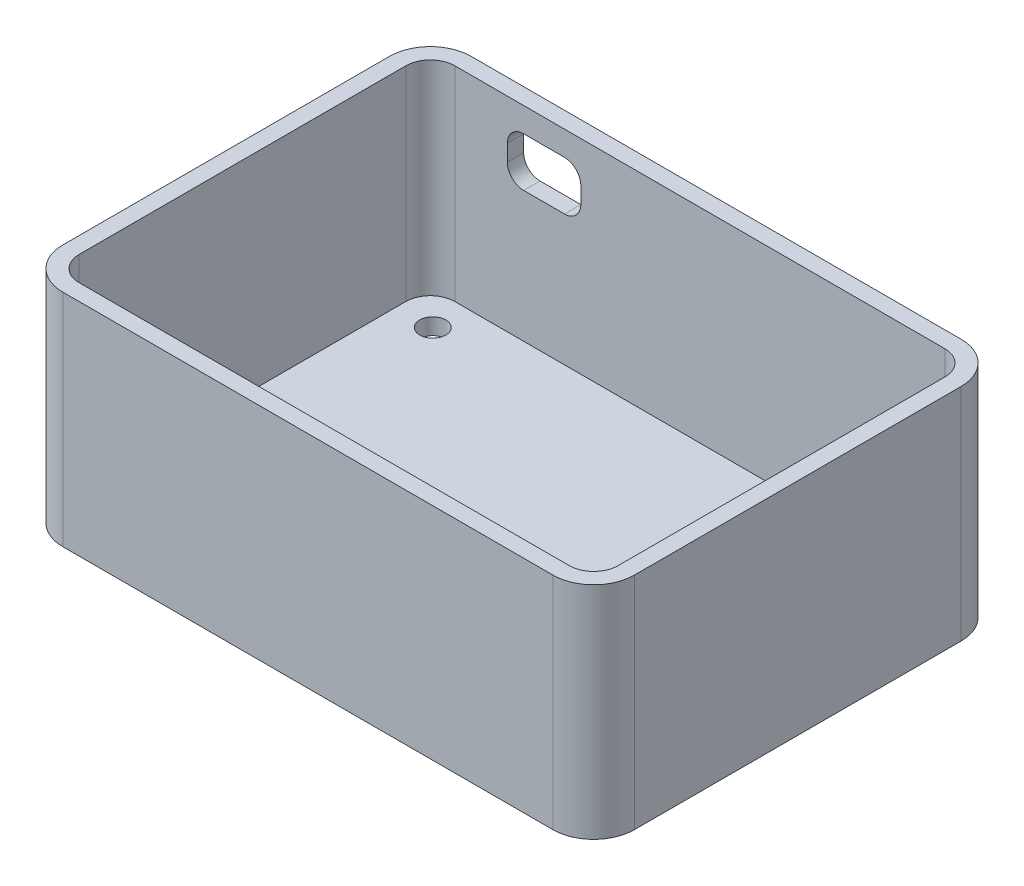
ISO-10303-21;
HEADER;
FILE_DESCRIPTION(('STEP AP214'),'2;1');
FILE_NAME('part.step','',(''),(''),'','','');
FILE_SCHEMA(('AUTOMOTIVE_DESIGN { 1 0 10303 214 1 1 1 1 }'));
ENDSEC;
DATA;
#1=APPLICATION_CONTEXT('core data for automotive mechanical design processes');
#2=APPLICATION_PROTOCOL_DEFINITION('international standard','automotive_design',2000,#1);
#3=PRODUCT_CONTEXT('',#1,'mechanical');
#4=PRODUCT('Part','Part','',(#3));
#5=PRODUCT_RELATED_PRODUCT_CATEGORY('part','',(#4));
#6=PRODUCT_DEFINITION_FORMATION('','',#4);
#7=PRODUCT_DEFINITION_CONTEXT('part definition',#1,'design');
#8=PRODUCT_DEFINITION('design','',#6,#7);
#9=PRODUCT_DEFINITION_SHAPE('','',#8);
#10=(LENGTH_UNIT() NAMED_UNIT(*) SI_UNIT(.MILLI.,.METRE.));
#11=(NAMED_UNIT(*) PLANE_ANGLE_UNIT() SI_UNIT($,.RADIAN.));
#12=(NAMED_UNIT(*) SI_UNIT($,.STERADIAN.) SOLID_ANGLE_UNIT());
#13=UNCERTAINTY_MEASURE_WITH_UNIT(LENGTH_MEASURE(1.E-05),#10,'distance_accuracy_value','');
#14=(GEOMETRIC_REPRESENTATION_CONTEXT(3) GLOBAL_UNCERTAINTY_ASSIGNED_CONTEXT((#13)) GLOBAL_UNIT_ASSIGNED_CONTEXT((#10,
#11,#12)) REPRESENTATION_CONTEXT('',''));
#15=CARTESIAN_POINT('',(0.,0.,0.));
#16=DIRECTION('',(0.,0.,1.));
#17=DIRECTION('',(1.,0.,0.));
#18=AXIS2_PLACEMENT_3D('',#15,#16,#17);
#19=CARTESIAN_POINT('',(65.,2.,45.));
#20=DIRECTION('',(0.,1.,0.));
#21=DIRECTION('',(0.,0.,1.));
#22=AXIS2_PLACEMENT_3D('',#19,#20,#21);
#23=PLANE('',#22);
#24=CARTESIAN_POINT('',(5.,2.,5.));
#25=DIRECTION('',(0.,1.,0.));
#26=DIRECTION('',(0.,0.,1.));
#27=AXIS2_PLACEMENT_3D('',#24,#25,#26);
#28=CIRCLE('',#27,3.);
#29=CARTESIAN_POINT('',(5.00000000000004,2.,2.));
#30=VERTEX_POINT('',#29);
#31=CARTESIAN_POINT('',(2.,2.,5.00000000000004));
#32=VERTEX_POINT('',#31);
#33=EDGE_CURVE('E270',#30,#32,#28,.T.);
#34=ORIENTED_EDGE('',*,*,#33,.T.);
#35=DIRECTION('',(0.,0.,1.));
#36=VECTOR('',#35,1.);
#37=CARTESIAN_POINT('',(2.,2.,5.00000000000004));
#38=LINE('',#37,#36);
#39=CARTESIAN_POINT('',(2.00000000000001,2.,45.));
#40=VERTEX_POINT('',#39);
#41=EDGE_CURVE('E291',#32,#40,#38,.T.);
#42=ORIENTED_EDGE('',*,*,#41,.T.);
#43=CARTESIAN_POINT('',(5.00000000000001,2.,45.));
#44=DIRECTION('',(0.,1.,0.));
#45=DIRECTION('',(0.,0.,1.));
#46=AXIS2_PLACEMENT_3D('',#43,#44,#45);
#47=CIRCLE('',#46,3.);
#48=CARTESIAN_POINT('',(5.,2.,48.));
#49=VERTEX_POINT('',#48);
#50=EDGE_CURVE('E293',#40,#49,#47,.T.);
#51=ORIENTED_EDGE('',*,*,#50,.T.);
#52=DIRECTION('',(1.,0.,0.));
#53=VECTOR('',#52,1.);
#54=CARTESIAN_POINT('',(5.00000000000003,2.,48.));
#55=LINE('',#54,#53);
#56=CARTESIAN_POINT('',(65.,2.,48.));
#57=VERTEX_POINT('',#56);
#58=EDGE_CURVE('E295',#49,#57,#55,.T.);
#59=ORIENTED_EDGE('',*,*,#58,.T.);
#60=CARTESIAN_POINT('',(65.,2.,45.));
#61=DIRECTION('',(0.,1.,0.));
#62=DIRECTION('',(0.,0.,1.));
#63=AXIS2_PLACEMENT_3D('',#60,#61,#62);
#64=CIRCLE('',#63,3.);
#65=CARTESIAN_POINT('',(68.,2.,45.));
#66=VERTEX_POINT('',#65);
#67=EDGE_CURVE('E297',#57,#66,#64,.T.);
#68=ORIENTED_EDGE('',*,*,#67,.T.);
#69=DIRECTION('',(0.,0.,-1.));
#70=VECTOR('',#69,1.);
#71=CARTESIAN_POINT('',(68.,2.,5.00000000000004));
#72=LINE('',#71,#70);
#73=CARTESIAN_POINT('',(68.,2.,5.00000000000004));
#74=VERTEX_POINT('',#73);
#75=EDGE_CURVE('E299',#66,#74,#72,.T.);
#76=ORIENTED_EDGE('',*,*,#75,.T.);
#77=CARTESIAN_POINT('',(65.,2.,5.));
#78=DIRECTION('',(0.,1.,0.));
#79=DIRECTION('',(0.,0.,-1.));
#80=AXIS2_PLACEMENT_3D('',#77,#78,#79);
#81=CIRCLE('',#80,3.);
#82=CARTESIAN_POINT('',(65.,2.,2.));
#83=VERTEX_POINT('',#82);
#84=EDGE_CURVE('E301',#74,#83,#81,.T.);
#85=ORIENTED_EDGE('',*,*,#84,.T.);
#86=DIRECTION('',(-1.,0.,0.));
#87=VECTOR('',#86,1.);
#88=CARTESIAN_POINT('',(5.00000000000004,2.,2.));
#89=LINE('',#88,#87);
#90=EDGE_CURVE('E274',#83,#30,#89,.T.);
#91=ORIENTED_EDGE('',*,*,#90,.T.);
#92=EDGE_LOOP('',(#34,#42,#51,#59,#68,#76,#85,#91));
#93=FACE_BOUND('',#92,.T.);
#94=CARTESIAN_POINT('',(6.4,2.,43.9));
#95=DIRECTION('',(0.,1.,0.));
#96=DIRECTION('',(0.,0.,1.));
#97=AXIS2_PLACEMENT_3D('',#94,#95,#96);
#98=CIRCLE('',#97,1.6);
#99=CARTESIAN_POINT('',(6.4,2.,45.5));
#100=VERTEX_POINT('',#99);
#101=EDGE_CURVE('E358',#100,#100,#98,.T.);
#102=ORIENTED_EDGE('',*,*,#101,.F.);
#103=EDGE_LOOP('',(#102));
#104=FACE_BOUND('',#103,.T.);
#105=CARTESIAN_POINT('',(6.4,2.,6.1));
#106=DIRECTION('',(0.,1.,0.));
#107=DIRECTION('',(0.,0.,1.));
#108=AXIS2_PLACEMENT_3D('',#105,#106,#107);
#109=CIRCLE('',#108,1.6);
#110=CARTESIAN_POINT('',(6.4,2.,7.7));
#111=VERTEX_POINT('',#110);
#112=EDGE_CURVE('E370',#111,#111,#109,.T.);
#113=ORIENTED_EDGE('',*,*,#112,.F.);
#114=EDGE_LOOP('',(#113));
#115=FACE_BOUND('',#114,.T.);
#116=CARTESIAN_POINT('',(63.6,2.,6.1));
#117=DIRECTION('',(0.,1.,0.));
#118=DIRECTION('',(0.,0.,1.));
#119=AXIS2_PLACEMENT_3D('',#116,#117,#118);
#120=CIRCLE('',#119,1.60000000000001);
#121=CARTESIAN_POINT('',(63.6,2.,7.70000000000001));
#122=VERTEX_POINT('',#121);
#123=EDGE_CURVE('E364',#122,#122,#120,.T.);
#124=ORIENTED_EDGE('',*,*,#123,.F.);
#125=EDGE_LOOP('',(#124));
#126=FACE_BOUND('',#125,.T.);
#127=CARTESIAN_POINT('',(63.6,2.,43.9));
#128=DIRECTION('',(0.,1.,0.));
#129=DIRECTION('',(0.,0.,1.));
#130=AXIS2_PLACEMENT_3D('',#127,#128,#129);
#131=CIRCLE('',#130,1.60000000000001);
#132=CARTESIAN_POINT('',(63.6,2.,45.5));
#133=VERTEX_POINT('',#132);
#134=EDGE_CURVE('E352',#133,#133,#131,.T.);
#135=ORIENTED_EDGE('',*,*,#134,.F.);
#136=EDGE_LOOP('',(#135));
#137=FACE_BOUND('',#136,.T.);
#138=ADVANCED_FACE('F38',(#93,#104,#115,#126,#137),#23,.T.);
#139=CARTESIAN_POINT('',(65.,0.,45.));
#140=DIRECTION('',(0.,1.,0.));
#141=DIRECTION('',(0.,0.,1.));
#142=AXIS2_PLACEMENT_3D('',#139,#140,#141);
#143=PLANE('',#142);
#144=CARTESIAN_POINT('',(65.,0.,45.));
#145=DIRECTION('',(0.,1.,0.));
#146=DIRECTION('',(0.,0.,1.));
#147=AXIS2_PLACEMENT_3D('',#144,#145,#146);
#148=CIRCLE('',#147,5.);
#149=CARTESIAN_POINT('',(65.,0.,50.));
#150=VERTEX_POINT('',#149);
#151=CARTESIAN_POINT('',(70.,0.,45.));
#152=VERTEX_POINT('',#151);
#153=EDGE_CURVE('E373',#150,#152,#148,.T.);
#154=ORIENTED_EDGE('',*,*,#153,.F.);
#155=DIRECTION('',(1.,0.,0.));
#156=VECTOR('',#155,1.);
#157=CARTESIAN_POINT('',(5.00000000000004,0.,50.));
#158=LINE('',#157,#156);
#159=CARTESIAN_POINT('',(5.00000000000004,0.,50.));
#160=VERTEX_POINT('',#159);
#161=EDGE_CURVE('E390',#160,#150,#158,.T.);
#162=ORIENTED_EDGE('',*,*,#161,.F.);
#163=CARTESIAN_POINT('',(5.00000000000001,0.,45.));
#164=DIRECTION('',(0.,1.,0.));
#165=DIRECTION('',(0.,0.,1.));
#166=AXIS2_PLACEMENT_3D('',#163,#164,#165);
#167=CIRCLE('',#166,5.);
#168=CARTESIAN_POINT('',(0.,0.,45.));
#169=VERTEX_POINT('',#168);
#170=EDGE_CURVE('E388',#169,#160,#167,.T.);
#171=ORIENTED_EDGE('',*,*,#170,.F.);
#172=DIRECTION('',(0.,0.,1.));
#173=VECTOR('',#172,1.);
#174=CARTESIAN_POINT('',(0.,0.,5.00000000000004));
#175=LINE('',#174,#173);
#176=CARTESIAN_POINT('',(0.,0.,5.00000000000004));
#177=VERTEX_POINT('',#176);
#178=EDGE_CURVE('E386',#177,#169,#175,.T.);
#179=ORIENTED_EDGE('',*,*,#178,.F.);
#180=CARTESIAN_POINT('',(5.,0.,5.));
#181=DIRECTION('',(0.,1.,0.));
#182=DIRECTION('',(0.,0.,1.));
#183=AXIS2_PLACEMENT_3D('',#180,#181,#182);
#184=CIRCLE('',#183,5.);
#185=CARTESIAN_POINT('',(5.00000000000004,0.,0.));
#186=VERTEX_POINT('',#185);
#187=EDGE_CURVE('E384',#186,#177,#184,.T.);
#188=ORIENTED_EDGE('',*,*,#187,.F.);
#189=DIRECTION('',(-1.,0.,0.));
#190=VECTOR('',#189,1.);
#191=CARTESIAN_POINT('',(5.00000000000004,0.,0.));
#192=LINE('',#191,#190);
#193=CARTESIAN_POINT('',(65.,0.,0.));
#194=VERTEX_POINT('',#193);
#195=EDGE_CURVE('E382',#194,#186,#192,.T.);
#196=ORIENTED_EDGE('',*,*,#195,.F.);
#197=CARTESIAN_POINT('',(65.,0.,5.));
#198=DIRECTION('',(0.,1.,0.));
#199=DIRECTION('',(0.,0.,-1.));
#200=AXIS2_PLACEMENT_3D('',#197,#198,#199);
#201=CIRCLE('',#200,5.);
#202=CARTESIAN_POINT('',(70.,0.,5.00000000000003));
#203=VERTEX_POINT('',#202);
#204=EDGE_CURVE('E380',#203,#194,#201,.T.);
#205=ORIENTED_EDGE('',*,*,#204,.F.);
#206=DIRECTION('',(0.,0.,-1.));
#207=VECTOR('',#206,1.);
#208=CARTESIAN_POINT('',(70.,0.,5.00000000000004));
#209=LINE('',#208,#207);
#210=EDGE_CURVE('E378',#152,#203,#209,.T.);
#211=ORIENTED_EDGE('',*,*,#210,.F.);
#212=EDGE_LOOP('',(#154,#162,#171,#179,#188,#196,#205,#211));
#213=FACE_BOUND('',#212,.T.);
#214=CARTESIAN_POINT('',(6.4,0.,6.1));
#215=DIRECTION('',(0.,1.,0.));
#216=DIRECTION('',(0.,0.,1.));
#217=AXIS2_PLACEMENT_3D('',#214,#215,#216);
#218=CIRCLE('',#217,1.6);
#219=CARTESIAN_POINT('',(6.4,0.,7.7));
#220=VERTEX_POINT('',#219);
#221=EDGE_CURVE('E367',#220,#220,#218,.T.);
#222=ORIENTED_EDGE('',*,*,#221,.T.);
#223=EDGE_LOOP('',(#222));
#224=FACE_BOUND('',#223,.T.);
#225=CARTESIAN_POINT('',(63.6,0.,6.1));
#226=DIRECTION('',(0.,1.,0.));
#227=DIRECTION('',(0.,0.,1.));
#228=AXIS2_PLACEMENT_3D('',#225,#226,#227);
#229=CIRCLE('',#228,1.60000000000001);
#230=CARTESIAN_POINT('',(63.6,0.,7.70000000000001));
#231=VERTEX_POINT('',#230);
#232=EDGE_CURVE('E361',#231,#231,#229,.T.);
#233=ORIENTED_EDGE('',*,*,#232,.T.);
#234=EDGE_LOOP('',(#233));
#235=FACE_BOUND('',#234,.T.);
#236=CARTESIAN_POINT('',(6.4,0.,43.9));
#237=DIRECTION('',(0.,1.,0.));
#238=DIRECTION('',(0.,0.,1.));
#239=AXIS2_PLACEMENT_3D('',#236,#237,#238);
#240=CIRCLE('',#239,1.6);
#241=CARTESIAN_POINT('',(6.4,0.,45.5));
#242=VERTEX_POINT('',#241);
#243=EDGE_CURVE('E355',#242,#242,#240,.T.);
#244=ORIENTED_EDGE('',*,*,#243,.T.);
#245=EDGE_LOOP('',(#244));
#246=FACE_BOUND('',#245,.T.);
#247=CARTESIAN_POINT('',(63.6,0.,43.9));
#248=DIRECTION('',(0.,1.,0.));
#249=DIRECTION('',(0.,0.,1.));
#250=AXIS2_PLACEMENT_3D('',#247,#248,#249);
#251=CIRCLE('',#250,1.60000000000001);
#252=CARTESIAN_POINT('',(63.6,0.,45.5));
#253=VERTEX_POINT('',#252);
#254=EDGE_CURVE('E351',#253,#253,#251,.T.);
#255=ORIENTED_EDGE('',*,*,#254,.T.);
#256=EDGE_LOOP('',(#255));
#257=FACE_BOUND('',#256,.T.);
#258=ADVANCED_FACE('F419',(#213,#224,#235,#246,#257),#143,.F.);
#259=CARTESIAN_POINT('',(65.,2.,45.));
#260=DIRECTION('',(0.,-1.,0.));
#261=DIRECTION('',(0.,0.,-1.));
#262=AXIS2_PLACEMENT_3D('',#259,#260,#261);
#263=CYLINDRICAL_SURFACE('',#262,5.);
#264=ORIENTED_EDGE('',*,*,#153,.T.);
#265=DIRECTION('',(0.,-1.,0.));
#266=VECTOR('',#265,1.);
#267=CARTESIAN_POINT('',(70.,2.,45.));
#268=LINE('',#267,#266);
#269=CARTESIAN_POINT('',(70.,27.,45.));
#270=VERTEX_POINT('',#269);
#271=EDGE_CURVE('E11',#270,#152,#268,.T.);
#272=ORIENTED_EDGE('',*,*,#271,.F.);
#273=CARTESIAN_POINT('',(65.,27.,45.));
#274=DIRECTION('',(0.,1.,0.));
#275=DIRECTION('',(0.,0.,1.));
#276=AXIS2_PLACEMENT_3D('',#273,#274,#275);
#277=CIRCLE('',#276,5.);
#278=CARTESIAN_POINT('',(65.,27.,50.));
#279=VERTEX_POINT('',#278);
#280=EDGE_CURVE('E333',#279,#270,#277,.T.);
#281=ORIENTED_EDGE('',*,*,#280,.F.);
#282=DIRECTION('',(0.,-1.,0.));
#283=VECTOR('',#282,1.);
#284=CARTESIAN_POINT('',(65.,2.,50.));
#285=LINE('',#284,#283);
#286=EDGE_CURVE('E392',#279,#150,#285,.T.);
#287=ORIENTED_EDGE('',*,*,#286,.T.);
#288=EDGE_LOOP('',(#264,#272,#281,#287));
#289=FACE_BOUND('',#288,.T.);
#290=ADVANCED_FACE('F40',(#289),#263,.T.);
#291=CARTESIAN_POINT('',(70.,2.,5.00000000000004));
#292=DIRECTION('',(-1.,0.,0.));
#293=DIRECTION('',(0.,0.,1.));
#294=AXIS2_PLACEMENT_3D('',#291,#292,#293);
#295=PLANE('',#294);
#296=ORIENTED_EDGE('',*,*,#210,.T.);
#297=DIRECTION('',(0.,-1.,0.));
#298=VECTOR('',#297,1.);
#299=CARTESIAN_POINT('',(70.,2.,5.00000000000003));
#300=LINE('',#299,#298);
#301=CARTESIAN_POINT('',(70.,27.,5.00000000000003));
#302=VERTEX_POINT('',#301);
#303=EDGE_CURVE('E46',#302,#203,#300,.T.);
#304=ORIENTED_EDGE('',*,*,#303,.F.);
#305=DIRECTION('',(0.,0.,-1.));
#306=VECTOR('',#305,1.);
#307=CARTESIAN_POINT('',(70.,27.,5.00000000000004));
#308=LINE('',#307,#306);
#309=EDGE_CURVE('E336',#270,#302,#308,.T.);
#310=ORIENTED_EDGE('',*,*,#309,.F.);
#311=ORIENTED_EDGE('',*,*,#271,.T.);
#312=EDGE_LOOP('',(#296,#304,#310,#311));
#313=FACE_BOUND('',#312,.T.);
#314=ADVANCED_FACE('F445',(#313),#295,.F.);
#315=CARTESIAN_POINT('',(65.,2.,5.));
#316=DIRECTION('',(0.,-1.,0.));
#317=DIRECTION('',(0.,0.,-1.));
#318=AXIS2_PLACEMENT_3D('',#315,#316,#317);
#319=CYLINDRICAL_SURFACE('',#318,5.);
#320=ORIENTED_EDGE('',*,*,#204,.T.);
#321=DIRECTION('',(0.,-1.,0.));
#322=VECTOR('',#321,1.);
#323=CARTESIAN_POINT('',(65.,2.,0.));
#324=LINE('',#323,#322);
#325=CARTESIAN_POINT('',(65.,27.,0.));
#326=VERTEX_POINT('',#325);
#327=EDGE_CURVE('E407',#326,#194,#324,.T.);
#328=ORIENTED_EDGE('',*,*,#327,.F.);
#329=CARTESIAN_POINT('',(65.,27.,5.));
#330=DIRECTION('',(0.,1.,0.));
#331=DIRECTION('',(0.,0.,-1.));
#332=AXIS2_PLACEMENT_3D('',#329,#330,#331);
#333=CIRCLE('',#332,5.);
#334=EDGE_CURVE('E339',#302,#326,#333,.T.);
#335=ORIENTED_EDGE('',*,*,#334,.F.);
#336=ORIENTED_EDGE('',*,*,#303,.T.);
#337=EDGE_LOOP('',(#320,#328,#335,#336));
#338=FACE_BOUND('',#337,.T.);
#339=ADVANCED_FACE('F413',(#338),#319,.T.);
#340=CARTESIAN_POINT('',(5.00000000000004,2.,0.));
#341=DIRECTION('',(0.,0.,1.));
#342=DIRECTION('',(1.,0.,0.));
#343=AXIS2_PLACEMENT_3D('',#340,#341,#342);
#344=PLANE('',#343);
#345=CARTESIAN_POINT('',(13.4286896433988,20.,0.));
#346=DIRECTION('',(0.,0.,-1.));
#347=DIRECTION('',(1.,0.,0.));
#348=AXIS2_PLACEMENT_3D('',#345,#346,#347);
#349=CIRCLE('',#348,2.);
#350=CARTESIAN_POINT('',(13.4286896433988,18.,0.));
#351=VERTEX_POINT('',#350);
#352=CARTESIAN_POINT('',(11.4286896433988,20.,0.));
#353=VERTEX_POINT('',#352);
#354=EDGE_CURVE('E217',#351,#353,#349,.T.);
#355=ORIENTED_EDGE('',*,*,#354,.F.);
#356=DIRECTION('',(-1.,0.,0.));
#357=VECTOR('',#356,1.);
#358=CARTESIAN_POINT('',(13.4286896433988,18.,0.));
#359=LINE('',#358,#357);
#360=CARTESIAN_POINT('',(18.4286896433988,18.,0.));
#361=VERTEX_POINT('',#360);
#362=EDGE_CURVE('E242',#361,#351,#359,.T.);
#363=ORIENTED_EDGE('',*,*,#362,.F.);
#364=CARTESIAN_POINT('',(18.4286896433988,20.,0.));
#365=DIRECTION('',(0.,0.,-1.));
#366=DIRECTION('',(1.,0.,0.));
#367=AXIS2_PLACEMENT_3D('',#364,#365,#366);
#368=CIRCLE('',#367,2.);
#369=CARTESIAN_POINT('',(20.4286896433988,20.,0.));
#370=VERTEX_POINT('',#369);
#371=EDGE_CURVE('E240',#370,#361,#368,.T.);
#372=ORIENTED_EDGE('',*,*,#371,.F.);
#373=DIRECTION('',(0.,-1.,0.));
#374=VECTOR('',#373,1.);
#375=CARTESIAN_POINT('',(20.4286896433988,22.,0.));
#376=LINE('',#375,#374);
#377=CARTESIAN_POINT('',(20.4286896433988,22.,0.));
#378=VERTEX_POINT('',#377);
#379=EDGE_CURVE('E53',#378,#370,#376,.T.);
#380=ORIENTED_EDGE('',*,*,#379,.F.);
#381=CARTESIAN_POINT('',(18.4286896433988,22.,0.));
#382=DIRECTION('',(0.,0.,-1.));
#383=DIRECTION('',(-1.,0.,0.));
#384=AXIS2_PLACEMENT_3D('',#381,#382,#383);
#385=CIRCLE('',#384,2.);
#386=CARTESIAN_POINT('',(18.4286896433988,24.,0.));
#387=VERTEX_POINT('',#386);
#388=EDGE_CURVE('E254',#387,#378,#385,.T.);
#389=ORIENTED_EDGE('',*,*,#388,.F.);
#390=DIRECTION('',(1.,0.,0.));
#391=VECTOR('',#390,1.);
#392=CARTESIAN_POINT('',(13.4286896433988,24.,0.));
#393=LINE('',#392,#391);
#394=CARTESIAN_POINT('',(13.4286896433988,24.,0.));
#395=VERTEX_POINT('',#394);
#396=EDGE_CURVE('E251',#395,#387,#393,.T.);
#397=ORIENTED_EDGE('',*,*,#396,.F.);
#398=CARTESIAN_POINT('',(13.4286896433988,22.,0.));
#399=DIRECTION('',(0.,0.,-1.));
#400=DIRECTION('',(1.,0.,0.));
#401=AXIS2_PLACEMENT_3D('',#398,#399,#400);
#402=CIRCLE('',#401,2.);
#403=CARTESIAN_POINT('',(11.4286896433988,22.,0.));
#404=VERTEX_POINT('',#403);
#405=EDGE_CURVE('E248',#404,#395,#402,.T.);
#406=ORIENTED_EDGE('',*,*,#405,.F.);
#407=DIRECTION('',(0.,1.,0.));
#408=VECTOR('',#407,1.);
#409=CARTESIAN_POINT('',(11.4286896433988,22.,0.));
#410=LINE('',#409,#408);
#411=EDGE_CURVE('E246',#353,#404,#410,.T.);
#412=ORIENTED_EDGE('',*,*,#411,.F.);
#413=EDGE_LOOP('',(#355,#363,#372,#380,#389,#397,#406,#412));
#414=FACE_BOUND('',#413,.T.);
#415=ORIENTED_EDGE('',*,*,#195,.T.);
#416=DIRECTION('',(0.,-1.,0.));
#417=VECTOR('',#416,1.);
#418=CARTESIAN_POINT('',(5.00000000000004,2.,0.));
#419=LINE('',#418,#417);
#420=CARTESIAN_POINT('',(5.00000000000004,27.,0.));
#421=VERTEX_POINT('',#420);
#422=EDGE_CURVE('E404',#421,#186,#419,.T.);
#423=ORIENTED_EDGE('',*,*,#422,.F.);
#424=DIRECTION('',(-1.,0.,0.));
#425=VECTOR('',#424,1.);
#426=CARTESIAN_POINT('',(5.00000000000004,27.,0.));
#427=LINE('',#426,#425);
#428=EDGE_CURVE('E342',#326,#421,#427,.T.);
#429=ORIENTED_EDGE('',*,*,#428,.F.);
#430=ORIENTED_EDGE('',*,*,#327,.T.);
#431=EDGE_LOOP('',(#415,#423,#429,#430));
#432=FACE_BOUND('',#431,.T.);
#433=ADVANCED_FACE('F424',(#414,#432),#344,.F.);
#434=CARTESIAN_POINT('',(5.,2.,5.));
#435=DIRECTION('',(0.,-1.,0.));
#436=DIRECTION('',(0.,0.,-1.));
#437=AXIS2_PLACEMENT_3D('',#434,#435,#436);
#438=CYLINDRICAL_SURFACE('',#437,5.);
#439=ORIENTED_EDGE('',*,*,#187,.T.);
#440=DIRECTION('',(0.,-1.,0.));
#441=VECTOR('',#440,1.);
#442=CARTESIAN_POINT('',(0.,2.,5.00000000000004));
#443=LINE('',#442,#441);
#444=CARTESIAN_POINT('',(0.,27.,5.00000000000004));
#445=VERTEX_POINT('',#444);
#446=EDGE_CURVE('E401',#445,#177,#443,.T.);
#447=ORIENTED_EDGE('',*,*,#446,.F.);
#448=CARTESIAN_POINT('',(5.,27.,5.));
#449=DIRECTION('',(0.,1.,0.));
#450=DIRECTION('',(0.,0.,1.));
#451=AXIS2_PLACEMENT_3D('',#448,#449,#450);
#452=CIRCLE('',#451,5.);
#453=EDGE_CURVE('E345',#421,#445,#452,.T.);
#454=ORIENTED_EDGE('',*,*,#453,.F.);
#455=ORIENTED_EDGE('',*,*,#422,.T.);
#456=EDGE_LOOP('',(#439,#447,#454,#455));
#457=FACE_BOUND('',#456,.T.);
#458=ADVANCED_FACE('F428',(#457),#438,.T.);
#459=CARTESIAN_POINT('',(0.,2.,5.00000000000004));
#460=DIRECTION('',(1.,0.,0.));
#461=DIRECTION('',(0.,0.,-1.));
#462=AXIS2_PLACEMENT_3D('',#459,#460,#461);
#463=PLANE('',#462);
#464=ORIENTED_EDGE('',*,*,#178,.T.);
#465=DIRECTION('',(0.,-1.,0.));
#466=VECTOR('',#465,1.);
#467=CARTESIAN_POINT('',(0.,2.,45.));
#468=LINE('',#467,#466);
#469=CARTESIAN_POINT('',(0.,27.,45.));
#470=VERTEX_POINT('',#469);
#471=EDGE_CURVE('E398',#470,#169,#468,.T.);
#472=ORIENTED_EDGE('',*,*,#471,.F.);
#473=DIRECTION('',(0.,0.,1.));
#474=VECTOR('',#473,1.);
#475=CARTESIAN_POINT('',(0.,27.,5.00000000000004));
#476=LINE('',#475,#474);
#477=EDGE_CURVE('E348',#445,#470,#476,.T.);
#478=ORIENTED_EDGE('',*,*,#477,.F.);
#479=ORIENTED_EDGE('',*,*,#446,.T.);
#480=EDGE_LOOP('',(#464,#472,#478,#479));
#481=FACE_BOUND('',#480,.T.);
#482=ADVANCED_FACE('F435',(#481),#463,.F.);
#483=CARTESIAN_POINT('',(5.00000000000001,2.,45.));
#484=DIRECTION('',(0.,-1.,0.));
#485=DIRECTION('',(0.,0.,-1.));
#486=AXIS2_PLACEMENT_3D('',#483,#484,#485);
#487=CYLINDRICAL_SURFACE('',#486,5.);
#488=ORIENTED_EDGE('',*,*,#170,.T.);
#489=DIRECTION('',(0.,-1.,0.));
#490=VECTOR('',#489,1.);
#491=CARTESIAN_POINT('',(5.00000000000004,2.,50.));
#492=LINE('',#491,#490);
#493=CARTESIAN_POINT('',(5.00000000000004,27.,50.));
#494=VERTEX_POINT('',#493);
#495=EDGE_CURVE('E395',#494,#160,#492,.T.);
#496=ORIENTED_EDGE('',*,*,#495,.F.);
#497=CARTESIAN_POINT('',(5.00000000000001,27.,45.));
#498=DIRECTION('',(0.,1.,0.));
#499=DIRECTION('',(0.,0.,1.));
#500=AXIS2_PLACEMENT_3D('',#497,#498,#499);
#501=CIRCLE('',#500,5.);
#502=EDGE_CURVE('E327',#470,#494,#501,.T.);
#503=ORIENTED_EDGE('',*,*,#502,.F.);
#504=ORIENTED_EDGE('',*,*,#471,.T.);
#505=EDGE_LOOP('',(#488,#496,#503,#504));
#506=FACE_BOUND('',#505,.T.);
#507=ADVANCED_FACE('F438',(#506),#487,.T.);
#508=CARTESIAN_POINT('',(5.00000000000004,2.,50.));
#509=DIRECTION('',(0.,0.,-1.));
#510=DIRECTION('',(-1.,0.,0.));
#511=AXIS2_PLACEMENT_3D('',#508,#509,#510);
#512=PLANE('',#511);
#513=ORIENTED_EDGE('',*,*,#161,.T.);
#514=ORIENTED_EDGE('',*,*,#286,.F.);
#515=DIRECTION('',(1.,0.,0.));
#516=VECTOR('',#515,1.);
#517=CARTESIAN_POINT('',(5.00000000000004,27.,50.));
#518=LINE('',#517,#516);
#519=EDGE_CURVE('E330',#494,#279,#518,.T.);
#520=ORIENTED_EDGE('',*,*,#519,.F.);
#521=ORIENTED_EDGE('',*,*,#495,.T.);
#522=EDGE_LOOP('',(#513,#514,#520,#521));
#523=FACE_BOUND('',#522,.T.);
#524=ADVANCED_FACE('F441',(#523),#512,.F.);
#525=CARTESIAN_POINT('',(6.4,2.,6.1));
#526=DIRECTION('',(0.,-1.,0.));
#527=DIRECTION('',(0.,0.,-1.));
#528=AXIS2_PLACEMENT_3D('',#525,#526,#527);
#529=CYLINDRICAL_SURFACE('',#528,1.6);
#530=ORIENTED_EDGE('',*,*,#112,.T.);
#531=EDGE_LOOP('',(#530));
#532=FACE_BOUND('',#531,.T.);
#533=ORIENTED_EDGE('',*,*,#221,.F.);
#534=EDGE_LOOP('',(#533));
#535=FACE_BOUND('',#534,.T.);
#536=ADVANCED_FACE('F461',(#532,#535),#529,.F.);
#537=CARTESIAN_POINT('',(63.6,2.,6.1));
#538=DIRECTION('',(0.,-1.,0.));
#539=DIRECTION('',(0.,0.,-1.));
#540=AXIS2_PLACEMENT_3D('',#537,#538,#539);
#541=CYLINDRICAL_SURFACE('',#540,1.60000000000001);
#542=ORIENTED_EDGE('',*,*,#123,.T.);
#543=EDGE_LOOP('',(#542));
#544=FACE_BOUND('',#543,.T.);
#545=ORIENTED_EDGE('',*,*,#232,.F.);
#546=EDGE_LOOP('',(#545));
#547=FACE_BOUND('',#546,.T.);
#548=ADVANCED_FACE('F540',(#544,#547),#541,.F.);
#549=CARTESIAN_POINT('',(6.4,2.,43.9));
#550=DIRECTION('',(0.,-1.,0.));
#551=DIRECTION('',(0.,0.,-1.));
#552=AXIS2_PLACEMENT_3D('',#549,#550,#551);
#553=CYLINDRICAL_SURFACE('',#552,1.6);
#554=ORIENTED_EDGE('',*,*,#101,.T.);
#555=EDGE_LOOP('',(#554));
#556=FACE_BOUND('',#555,.T.);
#557=ORIENTED_EDGE('',*,*,#243,.F.);
#558=EDGE_LOOP('',(#557));
#559=FACE_BOUND('',#558,.T.);
#560=ADVANCED_FACE('F537',(#556,#559),#553,.F.);
#561=CARTESIAN_POINT('',(63.6,2.,43.9));
#562=DIRECTION('',(0.,-1.,0.));
#563=DIRECTION('',(0.,0.,-1.));
#564=AXIS2_PLACEMENT_3D('',#561,#562,#563);
#565=CYLINDRICAL_SURFACE('',#564,1.60000000000001);
#566=ORIENTED_EDGE('',*,*,#134,.T.);
#567=EDGE_LOOP('',(#566));
#568=FACE_BOUND('',#567,.T.);
#569=ORIENTED_EDGE('',*,*,#254,.F.);
#570=EDGE_LOOP('',(#569));
#571=FACE_BOUND('',#570,.T.);
#572=ADVANCED_FACE('F534',(#568,#571),#565,.F.);
#573=CARTESIAN_POINT('',(5.00000000000001,27.,45.));
#574=DIRECTION('',(0.,1.,0.));
#575=DIRECTION('',(0.,0.,1.));
#576=AXIS2_PLACEMENT_3D('',#573,#574,#575);
#577=PLANE('',#576);
#578=ORIENTED_EDGE('',*,*,#502,.T.);
#579=ORIENTED_EDGE('',*,*,#519,.T.);
#580=ORIENTED_EDGE('',*,*,#280,.T.);
#581=ORIENTED_EDGE('',*,*,#309,.T.);
#582=ORIENTED_EDGE('',*,*,#334,.T.);
#583=ORIENTED_EDGE('',*,*,#428,.T.);
#584=ORIENTED_EDGE('',*,*,#453,.T.);
#585=ORIENTED_EDGE('',*,*,#477,.T.);
#586=EDGE_LOOP('',(#578,#579,#580,#581,#582,#583,#584,#585));
#587=FACE_BOUND('',#586,.T.);
#588=DIRECTION('',(0.,0.,1.));
#589=VECTOR('',#588,1.);
#590=CARTESIAN_POINT('',(2.,27.,5.00000000000004));
#591=LINE('',#590,#589);
#592=CARTESIAN_POINT('',(2.,27.,5.00000000000004));
#593=VERTEX_POINT('',#592);
#594=CARTESIAN_POINT('',(2.,27.,45.));
#595=VERTEX_POINT('',#594);
#596=EDGE_CURVE('E273',#593,#595,#591,.T.);
#597=ORIENTED_EDGE('',*,*,#596,.F.);
#598=CARTESIAN_POINT('',(5.,27.,5.));
#599=DIRECTION('',(0.,1.,0.));
#600=DIRECTION('',(0.,0.,1.));
#601=AXIS2_PLACEMENT_3D('',#598,#599,#600);
#602=CIRCLE('',#601,3.);
#603=CARTESIAN_POINT('',(5.00000000000004,27.,2.));
#604=VERTEX_POINT('',#603);
#605=EDGE_CURVE('E271',#604,#593,#602,.T.);
#606=ORIENTED_EDGE('',*,*,#605,.F.);
#607=DIRECTION('',(-1.,0.,0.));
#608=VECTOR('',#607,1.);
#609=CARTESIAN_POINT('',(5.00000000000004,27.,2.));
#610=LINE('',#609,#608);
#611=CARTESIAN_POINT('',(65.,27.,2.));
#612=VERTEX_POINT('',#611);
#613=EDGE_CURVE('E287',#612,#604,#610,.T.);
#614=ORIENTED_EDGE('',*,*,#613,.F.);
#615=CARTESIAN_POINT('',(65.,27.,5.));
#616=DIRECTION('',(0.,1.,0.));
#617=DIRECTION('',(0.,0.,-1.));
#618=AXIS2_PLACEMENT_3D('',#615,#616,#617);
#619=CIRCLE('',#618,3.);
#620=CARTESIAN_POINT('',(68.,27.,5.00000000000004));
#621=VERTEX_POINT('',#620);
#622=EDGE_CURVE('E284',#621,#612,#619,.T.);
#623=ORIENTED_EDGE('',*,*,#622,.F.);
#624=DIRECTION('',(0.,0.,-1.));
#625=VECTOR('',#624,1.);
#626=CARTESIAN_POINT('',(68.,27.,5.00000000000004));
#627=LINE('',#626,#625);
#628=CARTESIAN_POINT('',(68.,27.,45.));
#629=VERTEX_POINT('',#628);
#630=EDGE_CURVE('E282',#629,#621,#627,.T.);
#631=ORIENTED_EDGE('',*,*,#630,.F.);
#632=CARTESIAN_POINT('',(65.,27.,45.));
#633=DIRECTION('',(0.,1.,0.));
#634=DIRECTION('',(0.,0.,1.));
#635=AXIS2_PLACEMENT_3D('',#632,#633,#634);
#636=CIRCLE('',#635,3.);
#637=CARTESIAN_POINT('',(65.,27.,48.));
#638=VERTEX_POINT('',#637);
#639=EDGE_CURVE('E280',#638,#629,#636,.T.);
#640=ORIENTED_EDGE('',*,*,#639,.F.);
#641=DIRECTION('',(1.,0.,0.));
#642=VECTOR('',#641,1.);
#643=CARTESIAN_POINT('',(5.00000000000003,27.,48.));
#644=LINE('',#643,#642);
#645=CARTESIAN_POINT('',(5.00000000000001,27.,48.));
#646=VERTEX_POINT('',#645);
#647=EDGE_CURVE('E278',#646,#638,#644,.T.);
#648=ORIENTED_EDGE('',*,*,#647,.F.);
#649=CARTESIAN_POINT('',(5.00000000000001,27.,45.));
#650=DIRECTION('',(0.,1.,0.));
#651=DIRECTION('',(0.,0.,1.));
#652=AXIS2_PLACEMENT_3D('',#649,#650,#651);
#653=CIRCLE('',#652,3.);
#654=EDGE_CURVE('E276',#595,#646,#653,.T.);
#655=ORIENTED_EDGE('',*,*,#654,.F.);
#656=EDGE_LOOP('',(#597,#606,#614,#623,#631,#640,#648,#655));
#657=FACE_BOUND('',#656,.T.);
#658=ADVANCED_FACE('F431',(#587,#657),#577,.T.);
#659=CARTESIAN_POINT('',(5.,27.,5.));
#660=DIRECTION('',(0.,-1.,0.));
#661=DIRECTION('',(0.,0.,-1.));
#662=AXIS2_PLACEMENT_3D('',#659,#660,#661);
#663=CYLINDRICAL_SURFACE('',#662,3.);
#664=ORIENTED_EDGE('',*,*,#33,.F.);
#665=DIRECTION('',(0.,-1.,0.));
#666=VECTOR('',#665,1.);
#667=CARTESIAN_POINT('',(5.00000000000004,27.,2.));
#668=LINE('',#667,#666);
#669=EDGE_CURVE('E289',#604,#30,#668,.T.);
#670=ORIENTED_EDGE('',*,*,#669,.F.);
#671=ORIENTED_EDGE('',*,*,#605,.T.);
#672=DIRECTION('',(0.,-1.,0.));
#673=VECTOR('',#672,1.);
#674=CARTESIAN_POINT('',(2.,27.,5.00000000000004));
#675=LINE('',#674,#673);
#676=EDGE_CURVE('E324',#593,#32,#675,.T.);
#677=ORIENTED_EDGE('',*,*,#676,.T.);
#678=EDGE_LOOP('',(#664,#670,#671,#677));
#679=FACE_BOUND('',#678,.T.);
#680=ADVANCED_FACE('F527',(#679),#663,.F.);
#681=CARTESIAN_POINT('',(2.,27.,5.00000000000004));
#682=DIRECTION('',(1.,0.,0.));
#683=DIRECTION('',(0.,0.,-1.));
#684=AXIS2_PLACEMENT_3D('',#681,#682,#683);
#685=PLANE('',#684);
#686=ORIENTED_EDGE('',*,*,#41,.F.);
#687=ORIENTED_EDGE('',*,*,#676,.F.);
#688=ORIENTED_EDGE('',*,*,#596,.T.);
#689=DIRECTION('',(0.,-1.,0.));
#690=VECTOR('',#689,1.);
#691=CARTESIAN_POINT('',(2.,27.,45.));
#692=LINE('',#691,#690);
#693=EDGE_CURVE('E321',#595,#40,#692,.T.);
#694=ORIENTED_EDGE('',*,*,#693,.T.);
#695=EDGE_LOOP('',(#686,#687,#688,#694));
#696=FACE_BOUND('',#695,.T.);
#697=ADVANCED_FACE('F523',(#696),#685,.T.);
#698=CARTESIAN_POINT('',(5.00000000000001,27.,45.));
#699=DIRECTION('',(0.,-1.,0.));
#700=DIRECTION('',(0.,0.,-1.));
#701=AXIS2_PLACEMENT_3D('',#698,#699,#700);
#702=CYLINDRICAL_SURFACE('',#701,3.);
#703=ORIENTED_EDGE('',*,*,#50,.F.);
#704=ORIENTED_EDGE('',*,*,#693,.F.);
#705=ORIENTED_EDGE('',*,*,#654,.T.);
#706=DIRECTION('',(0.,-1.,0.));
#707=VECTOR('',#706,1.);
#708=CARTESIAN_POINT('',(5.00000000000001,27.,48.));
#709=LINE('',#708,#707);
#710=EDGE_CURVE('E318',#646,#49,#709,.T.);
#711=ORIENTED_EDGE('',*,*,#710,.T.);
#712=EDGE_LOOP('',(#703,#704,#705,#711));
#713=FACE_BOUND('',#712,.T.);
#714=ADVANCED_FACE('F519',(#713),#702,.F.);
#715=CARTESIAN_POINT('',(5.00000000000003,27.,48.));
#716=DIRECTION('',(0.,0.,-1.));
#717=DIRECTION('',(-1.,0.,0.));
#718=AXIS2_PLACEMENT_3D('',#715,#716,#717);
#719=PLANE('',#718);
#720=ORIENTED_EDGE('',*,*,#58,.F.);
#721=ORIENTED_EDGE('',*,*,#710,.F.);
#722=ORIENTED_EDGE('',*,*,#647,.T.);
#723=DIRECTION('',(0.,-1.,0.));
#724=VECTOR('',#723,1.);
#725=CARTESIAN_POINT('',(65.,27.,48.));
#726=LINE('',#725,#724);
#727=EDGE_CURVE('E315',#638,#57,#726,.T.);
#728=ORIENTED_EDGE('',*,*,#727,.T.);
#729=EDGE_LOOP('',(#720,#721,#722,#728));
#730=FACE_BOUND('',#729,.T.);
#731=ADVANCED_FACE('F515',(#730),#719,.T.);
#732=CARTESIAN_POINT('',(65.,27.,45.));
#733=DIRECTION('',(0.,-1.,0.));
#734=DIRECTION('',(0.,0.,-1.));
#735=AXIS2_PLACEMENT_3D('',#732,#733,#734);
#736=CYLINDRICAL_SURFACE('',#735,3.);
#737=ORIENTED_EDGE('',*,*,#67,.F.);
#738=ORIENTED_EDGE('',*,*,#727,.F.);
#739=ORIENTED_EDGE('',*,*,#639,.T.);
#740=DIRECTION('',(0.,-1.,0.));
#741=VECTOR('',#740,1.);
#742=CARTESIAN_POINT('',(68.,27.,45.));
#743=LINE('',#742,#741);
#744=EDGE_CURVE('E312',#629,#66,#743,.T.);
#745=ORIENTED_EDGE('',*,*,#744,.T.);
#746=EDGE_LOOP('',(#737,#738,#739,#745));
#747=FACE_BOUND('',#746,.T.);
#748=ADVANCED_FACE('F511',(#747),#736,.F.);
#749=CARTESIAN_POINT('',(68.,27.,5.00000000000004));
#750=DIRECTION('',(-1.,0.,0.));
#751=DIRECTION('',(0.,0.,1.));
#752=AXIS2_PLACEMENT_3D('',#749,#750,#751);
#753=PLANE('',#752);
#754=ORIENTED_EDGE('',*,*,#75,.F.);
#755=ORIENTED_EDGE('',*,*,#744,.F.);
#756=ORIENTED_EDGE('',*,*,#630,.T.);
#757=DIRECTION('',(0.,-1.,0.));
#758=VECTOR('',#757,1.);
#759=CARTESIAN_POINT('',(68.,27.,5.00000000000004));
#760=LINE('',#759,#758);
#761=EDGE_CURVE('E309',#621,#74,#760,.T.);
#762=ORIENTED_EDGE('',*,*,#761,.T.);
#763=EDGE_LOOP('',(#754,#755,#756,#762));
#764=FACE_BOUND('',#763,.T.);
#765=ADVANCED_FACE('F507',(#764),#753,.T.);
#766=CARTESIAN_POINT('',(65.,27.,5.));
#767=DIRECTION('',(0.,-1.,0.));
#768=DIRECTION('',(0.,0.,-1.));
#769=AXIS2_PLACEMENT_3D('',#766,#767,#768);
#770=CYLINDRICAL_SURFACE('',#769,3.);
#771=ORIENTED_EDGE('',*,*,#84,.F.);
#772=ORIENTED_EDGE('',*,*,#761,.F.);
#773=ORIENTED_EDGE('',*,*,#622,.T.);
#774=DIRECTION('',(0.,-1.,0.));
#775=VECTOR('',#774,1.);
#776=CARTESIAN_POINT('',(65.,27.,2.));
#777=LINE('',#776,#775);
#778=EDGE_CURVE('E306',#612,#83,#777,.T.);
#779=ORIENTED_EDGE('',*,*,#778,.T.);
#780=EDGE_LOOP('',(#771,#772,#773,#779));
#781=FACE_BOUND('',#780,.T.);
#782=ADVANCED_FACE('F504',(#781),#770,.F.);
#783=CARTESIAN_POINT('',(5.00000000000004,27.,2.));
#784=DIRECTION('',(0.,0.,1.));
#785=DIRECTION('',(1.,0.,0.));
#786=AXIS2_PLACEMENT_3D('',#783,#784,#785);
#787=PLANE('',#786);
#788=DIRECTION('',(-1.,0.,0.));
#789=VECTOR('',#788,1.);
#790=CARTESIAN_POINT('',(13.4286896433988,18.,2.));
#791=LINE('',#790,#789);
#792=CARTESIAN_POINT('',(18.4286896433988,18.,2.));
#793=VERTEX_POINT('',#792);
#794=CARTESIAN_POINT('',(13.4286896433988,18.,2.));
#795=VERTEX_POINT('',#794);
#796=EDGE_CURVE('E225',#793,#795,#791,.T.);
#797=ORIENTED_EDGE('',*,*,#796,.T.);
#798=CARTESIAN_POINT('',(13.4286896433988,20.,2.));
#799=DIRECTION('',(0.,0.,1.));
#800=DIRECTION('',(1.,0.,0.));
#801=AXIS2_PLACEMENT_3D('',#798,#799,#800);
#802=CIRCLE('',#801,2.);
#803=CARTESIAN_POINT('',(11.4286896433988,20.,2.));
#804=VERTEX_POINT('',#803);
#805=EDGE_CURVE('E211',#795,#804,#802,.F.);
#806=ORIENTED_EDGE('',*,*,#805,.T.);
#807=DIRECTION('',(0.,1.,0.));
#808=VECTOR('',#807,1.);
#809=CARTESIAN_POINT('',(11.4286896433988,22.,2.));
#810=LINE('',#809,#808);
#811=CARTESIAN_POINT('',(11.4286896433988,22.,2.));
#812=VERTEX_POINT('',#811);
#813=EDGE_CURVE('E200',#804,#812,#810,.T.);
#814=ORIENTED_EDGE('',*,*,#813,.T.);
#815=CARTESIAN_POINT('',(13.4286896433988,22.,2.));
#816=DIRECTION('',(0.,0.,1.));
#817=DIRECTION('',(1.,0.,0.));
#818=AXIS2_PLACEMENT_3D('',#815,#816,#817);
#819=CIRCLE('',#818,2.);
#820=CARTESIAN_POINT('',(13.4286896433988,24.,2.));
#821=VERTEX_POINT('',#820);
#822=EDGE_CURVE('E210',#812,#821,#819,.F.);
#823=ORIENTED_EDGE('',*,*,#822,.T.);
#824=DIRECTION('',(1.,0.,0.));
#825=VECTOR('',#824,1.);
#826=CARTESIAN_POINT('',(13.4286896433988,24.,2.));
#827=LINE('',#826,#825);
#828=CARTESIAN_POINT('',(18.4286896433988,24.,2.));
#829=VERTEX_POINT('',#828);
#830=EDGE_CURVE('E229',#821,#829,#827,.T.);
#831=ORIENTED_EDGE('',*,*,#830,.T.);
#832=CARTESIAN_POINT('',(18.4286896433988,22.,2.));
#833=DIRECTION('',(0.,0.,1.));
#834=DIRECTION('',(1.,0.,0.));
#835=AXIS2_PLACEMENT_3D('',#832,#833,#834);
#836=CIRCLE('',#835,2.);
#837=CARTESIAN_POINT('',(20.4286896433988,22.,2.));
#838=VERTEX_POINT('',#837);
#839=EDGE_CURVE('E232',#829,#838,#836,.F.);
#840=ORIENTED_EDGE('',*,*,#839,.T.);
#841=DIRECTION('',(0.,-1.,0.));
#842=VECTOR('',#841,1.);
#843=CARTESIAN_POINT('',(20.4286896433988,22.,2.));
#844=LINE('',#843,#842);
#845=CARTESIAN_POINT('',(20.4286896433988,20.,2.));
#846=VERTEX_POINT('',#845);
#847=EDGE_CURVE('E235',#838,#846,#844,.T.);
#848=ORIENTED_EDGE('',*,*,#847,.T.);
#849=CARTESIAN_POINT('',(18.4286896433988,20.,2.));
#850=DIRECTION('',(0.,0.,1.));
#851=DIRECTION('',(1.,0.,0.));
#852=AXIS2_PLACEMENT_3D('',#849,#850,#851);
#853=CIRCLE('',#852,2.);
#854=EDGE_CURVE('E238',#846,#793,#853,.F.);
#855=ORIENTED_EDGE('',*,*,#854,.T.);
#856=EDGE_LOOP('',(#797,#806,#814,#823,#831,#840,#848,#855));
#857=FACE_BOUND('',#856,.T.);
#858=ORIENTED_EDGE('',*,*,#90,.F.);
#859=ORIENTED_EDGE('',*,*,#778,.F.);
#860=ORIENTED_EDGE('',*,*,#613,.T.);
#861=ORIENTED_EDGE('',*,*,#669,.T.);
#862=EDGE_LOOP('',(#858,#859,#860,#861));
#863=FACE_BOUND('',#862,.T.);
#864=ADVANCED_FACE('F222',(#857,#863),#787,.T.);
#865=CARTESIAN_POINT('',(13.4286896433988,18.,50.001));
#866=DIRECTION('',(0.,-1.,0.));
#867=DIRECTION('',(1.,0.,0.));
#868=AXIS2_PLACEMENT_3D('',#865,#866,#867);
#869=PLANE('',#868);
#870=DIRECTION('',(0.,0.,-1.));
#871=VECTOR('',#870,1.);
#872=CARTESIAN_POINT('',(18.4286896433988,18.,50.001));
#873=LINE('',#872,#871);
#874=EDGE_CURVE('E61',#793,#361,#873,.T.);
#875=ORIENTED_EDGE('',*,*,#874,.T.);
#876=ORIENTED_EDGE('',*,*,#362,.T.);
#877=DIRECTION('',(0.,0.,-1.));
#878=VECTOR('',#877,1.);
#879=CARTESIAN_POINT('',(13.4286896433988,18.,50.001));
#880=LINE('',#879,#878);
#881=EDGE_CURVE('E219',#795,#351,#880,.T.);
#882=ORIENTED_EDGE('',*,*,#881,.F.);
#883=ORIENTED_EDGE('',*,*,#796,.F.);
#884=EDGE_LOOP('',(#875,#876,#882,#883));
#885=FACE_BOUND('',#884,.T.);
#886=ADVANCED_FACE('F500',(#885),#869,.F.);
#887=CARTESIAN_POINT('',(13.4286896433988,20.,50.001));
#888=DIRECTION('',(0.,0.,-1.));
#889=DIRECTION('',(-1.,0.,0.));
#890=AXIS2_PLACEMENT_3D('',#887,#888,#889);
#891=CYLINDRICAL_SURFACE('',#890,2.);
#892=ORIENTED_EDGE('',*,*,#881,.T.);
#893=ORIENTED_EDGE('',*,*,#354,.T.);
#894=DIRECTION('',(0.,0.,-1.));
#895=VECTOR('',#894,1.);
#896=CARTESIAN_POINT('',(11.4286896433988,20.,50.001));
#897=LINE('',#896,#895);
#898=EDGE_CURVE('E204',#804,#353,#897,.T.);
#899=ORIENTED_EDGE('',*,*,#898,.F.);
#900=ORIENTED_EDGE('',*,*,#805,.F.);
#901=EDGE_LOOP('',(#892,#893,#899,#900));
#902=FACE_BOUND('',#901,.T.);
#903=ADVANCED_FACE('F214',(#902),#891,.F.);
#904=CARTESIAN_POINT('',(11.4286896433988,22.,50.001));
#905=DIRECTION('',(-1.,0.,0.));
#906=DIRECTION('',(0.,0.,1.));
#907=AXIS2_PLACEMENT_3D('',#904,#905,#906);
#908=PLANE('',#907);
#909=ORIENTED_EDGE('',*,*,#898,.T.);
#910=ORIENTED_EDGE('',*,*,#411,.T.);
#911=DIRECTION('',(0.,0.,-1.));
#912=VECTOR('',#911,1.);
#913=CARTESIAN_POINT('',(11.4286896433988,22.,50.001));
#914=LINE('',#913,#912);
#915=EDGE_CURVE('E206',#812,#404,#914,.T.);
#916=ORIENTED_EDGE('',*,*,#915,.F.);
#917=ORIENTED_EDGE('',*,*,#813,.F.);
#918=EDGE_LOOP('',(#909,#910,#916,#917));
#919=FACE_BOUND('',#918,.T.);
#920=ADVANCED_FACE('F202',(#919),#908,.F.);
#921=CARTESIAN_POINT('',(13.4286896433988,22.,50.001));
#922=DIRECTION('',(0.,0.,-1.));
#923=DIRECTION('',(-1.,0.,0.));
#924=AXIS2_PLACEMENT_3D('',#921,#922,#923);
#925=CYLINDRICAL_SURFACE('',#924,2.);
#926=ORIENTED_EDGE('',*,*,#915,.T.);
#927=ORIENTED_EDGE('',*,*,#405,.T.);
#928=DIRECTION('',(0.,0.,-1.));
#929=VECTOR('',#928,1.);
#930=CARTESIAN_POINT('',(13.4286896433988,24.,50.001));
#931=LINE('',#930,#929);
#932=EDGE_CURVE('E264',#821,#395,#931,.T.);
#933=ORIENTED_EDGE('',*,*,#932,.F.);
#934=ORIENTED_EDGE('',*,*,#822,.F.);
#935=EDGE_LOOP('',(#926,#927,#933,#934));
#936=FACE_BOUND('',#935,.T.);
#937=ADVANCED_FACE('F483',(#936),#925,.F.);
#938=CARTESIAN_POINT('',(13.4286896433988,24.,50.001));
#939=DIRECTION('',(0.,1.,0.));
#940=DIRECTION('',(-1.,0.,0.));
#941=AXIS2_PLACEMENT_3D('',#938,#939,#940);
#942=PLANE('',#941);
#943=ORIENTED_EDGE('',*,*,#932,.T.);
#944=ORIENTED_EDGE('',*,*,#396,.T.);
#945=DIRECTION('',(0.,0.,-1.));
#946=VECTOR('',#945,1.);
#947=CARTESIAN_POINT('',(18.4286896433988,24.,50.001));
#948=LINE('',#947,#946);
#949=EDGE_CURVE('E262',#829,#387,#948,.T.);
#950=ORIENTED_EDGE('',*,*,#949,.F.);
#951=ORIENTED_EDGE('',*,*,#830,.F.);
#952=EDGE_LOOP('',(#943,#944,#950,#951));
#953=FACE_BOUND('',#952,.T.);
#954=ADVANCED_FACE('F486',(#953),#942,.F.);
#955=CARTESIAN_POINT('',(18.4286896433988,22.,50.001));
#956=DIRECTION('',(0.,0.,-1.));
#957=DIRECTION('',(-1.,0.,0.));
#958=AXIS2_PLACEMENT_3D('',#955,#956,#957);
#959=CYLINDRICAL_SURFACE('',#958,2.);
#960=ORIENTED_EDGE('',*,*,#949,.T.);
#961=ORIENTED_EDGE('',*,*,#388,.T.);
#962=DIRECTION('',(0.,0.,-1.));
#963=VECTOR('',#962,1.);
#964=CARTESIAN_POINT('',(20.4286896433988,22.,50.001));
#965=LINE('',#964,#963);
#966=EDGE_CURVE('E260',#838,#378,#965,.T.);
#967=ORIENTED_EDGE('',*,*,#966,.F.);
#968=ORIENTED_EDGE('',*,*,#839,.F.);
#969=EDGE_LOOP('',(#960,#961,#967,#968));
#970=FACE_BOUND('',#969,.T.);
#971=ADVANCED_FACE('F488',(#970),#959,.F.);
#972=CARTESIAN_POINT('',(20.4286896433988,22.,50.001));
#973=DIRECTION('',(1.,0.,0.));
#974=DIRECTION('',(0.,0.,-1.));
#975=AXIS2_PLACEMENT_3D('',#972,#973,#974);
#976=PLANE('',#975);
#977=ORIENTED_EDGE('',*,*,#966,.T.);
#978=ORIENTED_EDGE('',*,*,#379,.T.);
#979=DIRECTION('',(0.,0.,-1.));
#980=VECTOR('',#979,1.);
#981=CARTESIAN_POINT('',(20.4286896433988,20.,50.001));
#982=LINE('',#981,#980);
#983=EDGE_CURVE('E258',#846,#370,#982,.T.);
#984=ORIENTED_EDGE('',*,*,#983,.F.);
#985=ORIENTED_EDGE('',*,*,#847,.F.);
#986=EDGE_LOOP('',(#977,#978,#984,#985));
#987=FACE_BOUND('',#986,.T.);
#988=ADVANCED_FACE('F490',(#987),#976,.F.);
#989=CARTESIAN_POINT('',(18.4286896433988,20.,50.001));
#990=DIRECTION('',(0.,0.,-1.));
#991=DIRECTION('',(-1.,0.,0.));
#992=AXIS2_PLACEMENT_3D('',#989,#990,#991);
#993=CYLINDRICAL_SURFACE('',#992,2.);
#994=ORIENTED_EDGE('',*,*,#983,.T.);
#995=ORIENTED_EDGE('',*,*,#371,.T.);
#996=ORIENTED_EDGE('',*,*,#874,.F.);
#997=ORIENTED_EDGE('',*,*,#854,.F.);
#998=EDGE_LOOP('',(#994,#995,#996,#997));
#999=FACE_BOUND('',#998,.T.);
#1000=ADVANCED_FACE('F491',(#999),#993,.F.);
#1001=CLOSED_SHELL('',(#138,#258,#290,#314,#339,#433,#458,#482,#507,#524,#536,#548,#560,#572,
#658,#680,#697,#714,#731,#748,#765,#782,#864,#886,#903,#920,#937,#954,#971,#988,#1000));
#1002=MANIFOLD_SOLID_BREP('B2',#1001);
#1003=ADVANCED_BREP_SHAPE_REPRESENTATION('',(#18,#1002),#14);
#1004=SHAPE_DEFINITION_REPRESENTATION(#9,#1003);
ENDSEC;
END-ISO-10303-21;
